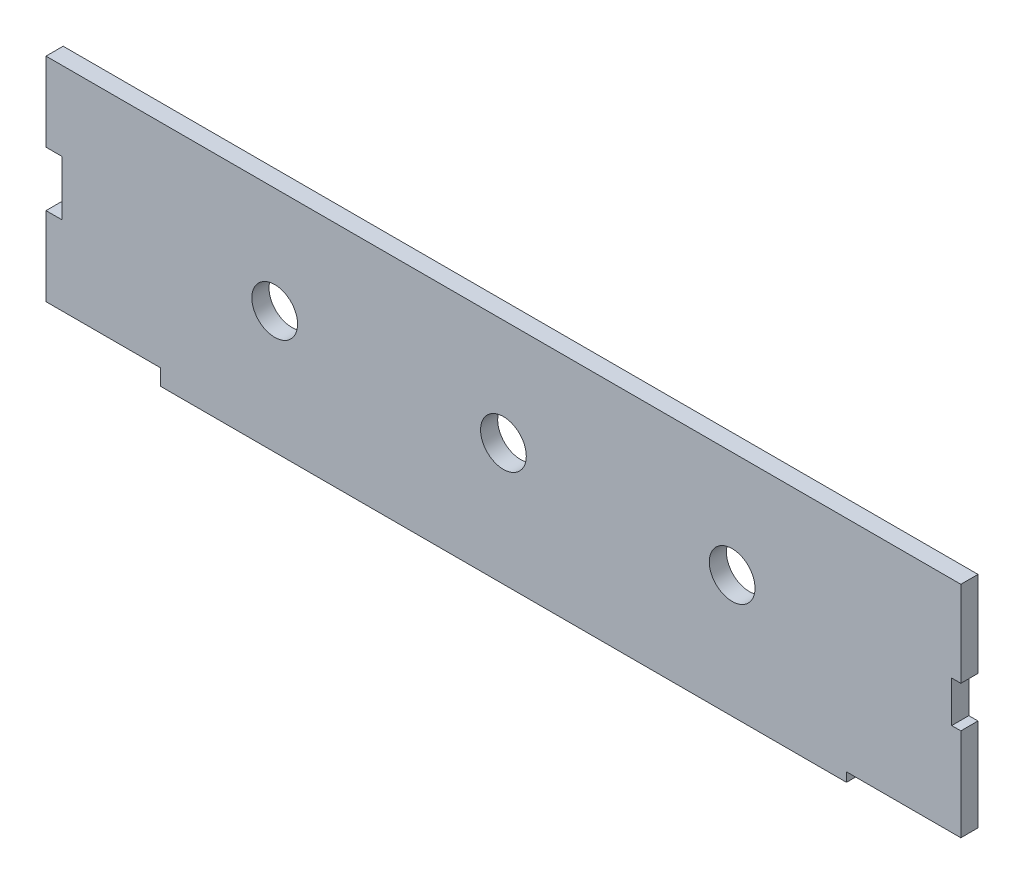
ISO-10303-21;
HEADER;
FILE_DESCRIPTION(('STEP AP214'),'2;1');
FILE_NAME('part.step','',(''),(''),'','','');
FILE_SCHEMA(('AUTOMOTIVE_DESIGN { 1 0 10303 214 1 1 1 1 }'));
ENDSEC;
DATA;
#1=APPLICATION_CONTEXT('core data for automotive mechanical design processes');
#2=APPLICATION_PROTOCOL_DEFINITION('international standard','automotive_design',2000,#1);
#3=PRODUCT_CONTEXT('',#1,'mechanical');
#4=PRODUCT('Part','Part','',(#3));
#5=PRODUCT_RELATED_PRODUCT_CATEGORY('part','',(#4));
#6=PRODUCT_DEFINITION_FORMATION('','',#4);
#7=PRODUCT_DEFINITION_CONTEXT('part definition',#1,'design');
#8=PRODUCT_DEFINITION('design','',#6,#7);
#9=PRODUCT_DEFINITION_SHAPE('','',#8);
#10=(LENGTH_UNIT() NAMED_UNIT(*) SI_UNIT(.MILLI.,.METRE.));
#11=(NAMED_UNIT(*) PLANE_ANGLE_UNIT() SI_UNIT($,.RADIAN.));
#12=(NAMED_UNIT(*) SI_UNIT($,.STERADIAN.) SOLID_ANGLE_UNIT());
#13=UNCERTAINTY_MEASURE_WITH_UNIT(LENGTH_MEASURE(1.E-05),#10,'distance_accuracy_value','');
#14=(GEOMETRIC_REPRESENTATION_CONTEXT(3) GLOBAL_UNCERTAINTY_ASSIGNED_CONTEXT((#13)) GLOBAL_UNIT_ASSIGNED_CONTEXT((#10,
#11,#12)) REPRESENTATION_CONTEXT('',''));
#15=CARTESIAN_POINT('',(0.,0.,0.));
#16=DIRECTION('',(0.,0.,1.));
#17=DIRECTION('',(1.,0.,0.));
#18=AXIS2_PLACEMENT_3D('',#15,#16,#17);
#19=CARTESIAN_POINT('',(0.,0.,1.5));
#20=DIRECTION('',(0.,0.,-1.));
#21=DIRECTION('',(-1.,0.,0.));
#22=AXIS2_PLACEMENT_3D('',#19,#20,#21);
#23=PLANE('',#22);
#24=DIRECTION('',(0.,-1.,0.));
#25=VECTOR('',#24,1.);
#26=CARTESIAN_POINT('',(-40.,2.4,1.5));
#27=LINE('',#26,#25);
#28=CARTESIAN_POINT('',(-40.,9.3,1.5));
#29=VERTEX_POINT('',#28);
#30=CARTESIAN_POINT('',(-40.,2.4,1.5));
#31=VERTEX_POINT('',#30);
#32=EDGE_CURVE('E209',#29,#31,#27,.T.);
#33=ORIENTED_EDGE('',*,*,#32,.T.);
#34=DIRECTION('',(1.,0.,0.));
#35=VECTOR('',#34,1.);
#36=CARTESIAN_POINT('',(-38.6,2.4,1.5));
#37=LINE('',#36,#35);
#38=CARTESIAN_POINT('',(-38.6,2.4,1.5));
#39=VERTEX_POINT('',#38);
#40=EDGE_CURVE('E117',#31,#39,#37,.T.);
#41=ORIENTED_EDGE('',*,*,#40,.T.);
#42=DIRECTION('',(0.,-1.,0.));
#43=VECTOR('',#42,1.);
#44=CARTESIAN_POINT('',(-38.6,-2.4,1.5));
#45=LINE('',#44,#43);
#46=CARTESIAN_POINT('',(-38.6,-2.4,1.5));
#47=VERTEX_POINT('',#46);
#48=EDGE_CURVE('E248',#39,#47,#45,.T.);
#49=ORIENTED_EDGE('',*,*,#48,.T.);
#50=DIRECTION('',(-1.,0.,0.));
#51=VECTOR('',#50,1.);
#52=CARTESIAN_POINT('',(-40.,-2.4,1.5));
#53=LINE('',#52,#51);
#54=CARTESIAN_POINT('',(-40.,-2.4,1.5));
#55=VERTEX_POINT('',#54);
#56=EDGE_CURVE('E267',#47,#55,#53,.T.);
#57=ORIENTED_EDGE('',*,*,#56,.T.);
#58=DIRECTION('',(0.,-1.,0.));
#59=VECTOR('',#58,1.);
#60=CARTESIAN_POINT('',(-40.,-9.3,1.5));
#61=LINE('',#60,#59);
#62=CARTESIAN_POINT('',(-40.,-9.3,1.5));
#63=VERTEX_POINT('',#62);
#64=EDGE_CURVE('E264',#55,#63,#61,.T.);
#65=ORIENTED_EDGE('',*,*,#64,.T.);
#66=DIRECTION('',(1.,0.,0.));
#67=VECTOR('',#66,1.);
#68=CARTESIAN_POINT('',(-30.,-9.3,1.5));
#69=LINE('',#68,#67);
#70=CARTESIAN_POINT('',(-30.,-9.3,1.5));
#71=VERTEX_POINT('',#70);
#72=EDGE_CURVE('E266',#63,#71,#69,.T.);
#73=ORIENTED_EDGE('',*,*,#72,.T.);
#74=DIRECTION('',(0.,-1.,0.));
#75=VECTOR('',#74,1.);
#76=CARTESIAN_POINT('',(-30.,-10.7,1.5));
#77=LINE('',#76,#75);
#78=CARTESIAN_POINT('',(-30.,-10.7,1.5));
#79=VERTEX_POINT('',#78);
#80=EDGE_CURVE('E269',#71,#79,#77,.T.);
#81=ORIENTED_EDGE('',*,*,#80,.T.);
#82=DIRECTION('',(1.,0.,0.));
#83=VECTOR('',#82,1.);
#84=CARTESIAN_POINT('',(30.,-10.7,1.5));
#85=LINE('',#84,#83);
#86=CARTESIAN_POINT('',(30.,-10.7,1.5));
#87=VERTEX_POINT('',#86);
#88=EDGE_CURVE('E275',#79,#87,#85,.T.);
#89=ORIENTED_EDGE('',*,*,#88,.T.);
#90=DIRECTION('',(0.,1.,0.));
#91=VECTOR('',#90,1.);
#92=CARTESIAN_POINT('',(30.,-9.89999999999999,1.5));
#93=LINE('',#92,#91);
#94=CARTESIAN_POINT('',(30.,-9.89999999999999,1.5));
#95=VERTEX_POINT('',#94);
#96=EDGE_CURVE('E277',#87,#95,#93,.T.);
#97=ORIENTED_EDGE('',*,*,#96,.T.);
#98=DIRECTION('',(1.,0.,0.));
#99=VECTOR('',#98,1.);
#100=CARTESIAN_POINT('',(40.,-9.89999999999998,1.5));
#101=LINE('',#100,#99);
#102=CARTESIAN_POINT('',(40.,-9.89999999999998,1.5));
#103=VERTEX_POINT('',#102);
#104=EDGE_CURVE('E279',#95,#103,#101,.T.);
#105=ORIENTED_EDGE('',*,*,#104,.T.);
#106=DIRECTION('',(0.,1.,0.));
#107=VECTOR('',#106,1.);
#108=CARTESIAN_POINT('',(40.,-1.8,1.5));
#109=LINE('',#108,#107);
#110=CARTESIAN_POINT('',(40.,-1.8,1.5));
#111=VERTEX_POINT('',#110);
#112=EDGE_CURVE('E281',#103,#111,#109,.T.);
#113=ORIENTED_EDGE('',*,*,#112,.T.);
#114=DIRECTION('',(-1.,0.,0.));
#115=VECTOR('',#114,1.);
#116=CARTESIAN_POINT('',(39.2,-1.8,1.5));
#117=LINE('',#116,#115);
#118=CARTESIAN_POINT('',(39.2,-1.8,1.5));
#119=VERTEX_POINT('',#118);
#120=EDGE_CURVE('E283',#111,#119,#117,.T.);
#121=ORIENTED_EDGE('',*,*,#120,.T.);
#122=DIRECTION('',(0.,1.,0.));
#123=VECTOR('',#122,1.);
#124=CARTESIAN_POINT('',(39.2,1.8,1.5));
#125=LINE('',#124,#123);
#126=CARTESIAN_POINT('',(39.2,1.8,1.5));
#127=VERTEX_POINT('',#126);
#128=EDGE_CURVE('E160',#119,#127,#125,.T.);
#129=ORIENTED_EDGE('',*,*,#128,.T.);
#130=DIRECTION('',(1.,0.,0.));
#131=VECTOR('',#130,1.);
#132=CARTESIAN_POINT('',(40.,1.8,1.5));
#133=LINE('',#132,#131);
#134=CARTESIAN_POINT('',(40.,1.8,1.5));
#135=VERTEX_POINT('',#134);
#136=EDGE_CURVE('E154',#127,#135,#133,.T.);
#137=ORIENTED_EDGE('',*,*,#136,.T.);
#138=DIRECTION('',(0.,1.,0.));
#139=VECTOR('',#138,1.);
#140=CARTESIAN_POINT('',(40.,9.3,1.5));
#141=LINE('',#140,#139);
#142=CARTESIAN_POINT('',(40.,9.3,1.5));
#143=VERTEX_POINT('',#142);
#144=EDGE_CURVE('E158',#135,#143,#141,.T.);
#145=ORIENTED_EDGE('',*,*,#144,.T.);
#146=DIRECTION('',(-1.,0.,0.));
#147=VECTOR('',#146,1.);
#148=CARTESIAN_POINT('',(-40.,9.3,1.5));
#149=LINE('',#148,#147);
#150=EDGE_CURVE('E50',#143,#29,#149,.T.);
#151=ORIENTED_EDGE('',*,*,#150,.T.);
#152=EDGE_LOOP('',(#33,#41,#49,#57,#65,#73,#81,#89,#97,#105,#113,#121,#129,#137,#145,#151));
#153=FACE_BOUND('',#152,.T.);
#154=CARTESIAN_POINT('',(20.,0.,1.5));
#155=DIRECTION('',(0.,0.,1.));
#156=DIRECTION('',(1.,0.,0.));
#157=AXIS2_PLACEMENT_3D('',#154,#155,#156);
#158=CIRCLE('',#157,2.);
#159=CARTESIAN_POINT('',(22.,0.,1.5));
#160=VERTEX_POINT('',#159);
#161=EDGE_CURVE('E182',#160,#160,#158,.T.);
#162=ORIENTED_EDGE('',*,*,#161,.F.);
#163=EDGE_LOOP('',(#162));
#164=FACE_BOUND('',#163,.T.);
#165=CARTESIAN_POINT('',(0.,0.,1.5));
#166=DIRECTION('',(0.,0.,1.));
#167=DIRECTION('',(1.,0.,0.));
#168=AXIS2_PLACEMENT_3D('',#165,#166,#167);
#169=CIRCLE('',#168,2.);
#170=CARTESIAN_POINT('',(2.,0.,1.5));
#171=VERTEX_POINT('',#170);
#172=EDGE_CURVE('E337',#171,#171,#169,.T.);
#173=ORIENTED_EDGE('',*,*,#172,.F.);
#174=EDGE_LOOP('',(#173));
#175=FACE_BOUND('',#174,.T.);
#176=CARTESIAN_POINT('',(-20.,0.,1.5));
#177=DIRECTION('',(0.,0.,1.));
#178=DIRECTION('',(1.,0.,0.));
#179=AXIS2_PLACEMENT_3D('',#176,#177,#178);
#180=CIRCLE('',#179,2.);
#181=CARTESIAN_POINT('',(-18.,0.,1.5));
#182=VERTEX_POINT('',#181);
#183=EDGE_CURVE('E328',#182,#182,#180,.T.);
#184=ORIENTED_EDGE('',*,*,#183,.F.);
#185=EDGE_LOOP('',(#184));
#186=FACE_BOUND('',#185,.T.);
#187=ADVANCED_FACE('F33',(#153,#164,#175,#186),#23,.F.);
#188=CARTESIAN_POINT('',(0.,0.,0.));
#189=DIRECTION('',(0.,0.,-1.));
#190=DIRECTION('',(-1.,0.,0.));
#191=AXIS2_PLACEMENT_3D('',#188,#189,#190);
#192=PLANE('',#191);
#193=CARTESIAN_POINT('',(0.,0.,0.));
#194=DIRECTION('',(0.,0.,1.));
#195=DIRECTION('',(1.,0.,0.));
#196=AXIS2_PLACEMENT_3D('',#193,#194,#195);
#197=CIRCLE('',#196,2.);
#198=CARTESIAN_POINT('',(2.,0.,0.));
#199=VERTEX_POINT('',#198);
#200=EDGE_CURVE('E334',#199,#199,#197,.T.);
#201=ORIENTED_EDGE('',*,*,#200,.T.);
#202=EDGE_LOOP('',(#201));
#203=FACE_BOUND('',#202,.T.);
#204=DIRECTION('',(0.,-1.,0.));
#205=VECTOR('',#204,1.);
#206=CARTESIAN_POINT('',(-40.,2.4,0.));
#207=LINE('',#206,#205);
#208=CARTESIAN_POINT('',(-40.,9.3,0.));
#209=VERTEX_POINT('',#208);
#210=CARTESIAN_POINT('',(-40.,2.4,0.));
#211=VERTEX_POINT('',#210);
#212=EDGE_CURVE('E178',#209,#211,#207,.T.);
#213=ORIENTED_EDGE('',*,*,#212,.F.);
#214=DIRECTION('',(-1.,0.,0.));
#215=VECTOR('',#214,1.);
#216=CARTESIAN_POINT('',(-40.,9.3,0.));
#217=LINE('',#216,#215);
#218=CARTESIAN_POINT('',(40.,9.3,0.));
#219=VERTEX_POINT('',#218);
#220=EDGE_CURVE('E109',#219,#209,#217,.T.);
#221=ORIENTED_EDGE('',*,*,#220,.F.);
#222=DIRECTION('',(0.,1.,0.));
#223=VECTOR('',#222,1.);
#224=CARTESIAN_POINT('',(40.,9.3,0.));
#225=LINE('',#224,#223);
#226=CARTESIAN_POINT('',(40.,1.8,0.));
#227=VERTEX_POINT('',#226);
#228=EDGE_CURVE('E103',#227,#219,#225,.T.);
#229=ORIENTED_EDGE('',*,*,#228,.F.);
#230=DIRECTION('',(1.,0.,0.));
#231=VECTOR('',#230,1.);
#232=CARTESIAN_POINT('',(40.,1.8,0.));
#233=LINE('',#232,#231);
#234=CARTESIAN_POINT('',(39.2,1.8,0.));
#235=VERTEX_POINT('',#234);
#236=EDGE_CURVE('E168',#235,#227,#233,.T.);
#237=ORIENTED_EDGE('',*,*,#236,.F.);
#238=DIRECTION('',(0.,1.,0.));
#239=VECTOR('',#238,1.);
#240=CARTESIAN_POINT('',(39.2,1.8,0.));
#241=LINE('',#240,#239);
#242=CARTESIAN_POINT('',(39.2,-1.8,0.));
#243=VERTEX_POINT('',#242);
#244=EDGE_CURVE('E204',#243,#235,#241,.T.);
#245=ORIENTED_EDGE('',*,*,#244,.F.);
#246=DIRECTION('',(-1.,0.,0.));
#247=VECTOR('',#246,1.);
#248=CARTESIAN_POINT('',(39.2,-1.8,0.));
#249=LINE('',#248,#247);
#250=CARTESIAN_POINT('',(40.,-1.8,0.));
#251=VERTEX_POINT('',#250);
#252=EDGE_CURVE('E202',#251,#243,#249,.T.);
#253=ORIENTED_EDGE('',*,*,#252,.F.);
#254=DIRECTION('',(0.,1.,0.));
#255=VECTOR('',#254,1.);
#256=CARTESIAN_POINT('',(40.,-1.8,0.));
#257=LINE('',#256,#255);
#258=CARTESIAN_POINT('',(40.,-9.89999999999998,0.));
#259=VERTEX_POINT('',#258);
#260=EDGE_CURVE('E200',#259,#251,#257,.T.);
#261=ORIENTED_EDGE('',*,*,#260,.F.);
#262=DIRECTION('',(1.,0.,0.));
#263=VECTOR('',#262,1.);
#264=CARTESIAN_POINT('',(40.,-9.89999999999998,0.));
#265=LINE('',#264,#263);
#266=CARTESIAN_POINT('',(30.,-9.89999999999999,0.));
#267=VERTEX_POINT('',#266);
#268=EDGE_CURVE('E198',#267,#259,#265,.T.);
#269=ORIENTED_EDGE('',*,*,#268,.F.);
#270=DIRECTION('',(0.,1.,0.));
#271=VECTOR('',#270,1.);
#272=CARTESIAN_POINT('',(30.,-9.89999999999999,0.));
#273=LINE('',#272,#271);
#274=CARTESIAN_POINT('',(30.,-10.7,0.));
#275=VERTEX_POINT('',#274);
#276=EDGE_CURVE('E196',#275,#267,#273,.T.);
#277=ORIENTED_EDGE('',*,*,#276,.F.);
#278=DIRECTION('',(1.,0.,0.));
#279=VECTOR('',#278,1.);
#280=CARTESIAN_POINT('',(30.,-10.7,0.));
#281=LINE('',#280,#279);
#282=CARTESIAN_POINT('',(-30.,-10.7,0.));
#283=VERTEX_POINT('',#282);
#284=EDGE_CURVE('E194',#283,#275,#281,.T.);
#285=ORIENTED_EDGE('',*,*,#284,.F.);
#286=DIRECTION('',(0.,-1.,0.));
#287=VECTOR('',#286,1.);
#288=CARTESIAN_POINT('',(-30.,-10.7,0.));
#289=LINE('',#288,#287);
#290=CARTESIAN_POINT('',(-30.,-9.3,0.));
#291=VERTEX_POINT('',#290);
#292=EDGE_CURVE('E192',#291,#283,#289,.T.);
#293=ORIENTED_EDGE('',*,*,#292,.F.);
#294=DIRECTION('',(1.,0.,0.));
#295=VECTOR('',#294,1.);
#296=CARTESIAN_POINT('',(-30.,-9.3,0.));
#297=LINE('',#296,#295);
#298=CARTESIAN_POINT('',(-40.,-9.3,0.));
#299=VERTEX_POINT('',#298);
#300=EDGE_CURVE('E190',#299,#291,#297,.T.);
#301=ORIENTED_EDGE('',*,*,#300,.F.);
#302=DIRECTION('',(0.,-1.,0.));
#303=VECTOR('',#302,1.);
#304=CARTESIAN_POINT('',(-40.,-9.3,0.));
#305=LINE('',#304,#303);
#306=CARTESIAN_POINT('',(-40.,-2.4,0.));
#307=VERTEX_POINT('',#306);
#308=EDGE_CURVE('E188',#307,#299,#305,.T.);
#309=ORIENTED_EDGE('',*,*,#308,.F.);
#310=DIRECTION('',(-1.,0.,0.));
#311=VECTOR('',#310,1.);
#312=CARTESIAN_POINT('',(-40.,-2.4,0.));
#313=LINE('',#312,#311);
#314=CARTESIAN_POINT('',(-38.6,-2.4,0.));
#315=VERTEX_POINT('',#314);
#316=EDGE_CURVE('E186',#315,#307,#313,.T.);
#317=ORIENTED_EDGE('',*,*,#316,.F.);
#318=DIRECTION('',(0.,-1.,0.));
#319=VECTOR('',#318,1.);
#320=CARTESIAN_POINT('',(-38.6,-2.4,0.));
#321=LINE('',#320,#319);
#322=CARTESIAN_POINT('',(-38.6,2.4,0.));
#323=VERTEX_POINT('',#322);
#324=EDGE_CURVE('E184',#323,#315,#321,.T.);
#325=ORIENTED_EDGE('',*,*,#324,.F.);
#326=DIRECTION('',(1.,0.,0.));
#327=VECTOR('',#326,1.);
#328=CARTESIAN_POINT('',(-38.6,2.4,0.));
#329=LINE('',#328,#327);
#330=EDGE_CURVE('E181',#211,#323,#329,.T.);
#331=ORIENTED_EDGE('',*,*,#330,.F.);
#332=EDGE_LOOP('',(#213,#221,#229,#237,#245,#253,#261,#269,#277,#285,#293,#301,#309,#317,#325,#331));
#333=FACE_BOUND('',#332,.T.);
#334=CARTESIAN_POINT('',(20.,0.,0.));
#335=DIRECTION('',(0.,0.,1.));
#336=DIRECTION('',(1.,0.,0.));
#337=AXIS2_PLACEMENT_3D('',#334,#335,#336);
#338=CIRCLE('',#337,2.);
#339=CARTESIAN_POINT('',(22.,0.,0.));
#340=VERTEX_POINT('',#339);
#341=EDGE_CURVE('E340',#340,#340,#338,.T.);
#342=ORIENTED_EDGE('',*,*,#341,.T.);
#343=EDGE_LOOP('',(#342));
#344=FACE_BOUND('',#343,.T.);
#345=CARTESIAN_POINT('',(-20.,0.,0.));
#346=DIRECTION('',(0.,0.,1.));
#347=DIRECTION('',(1.,0.,0.));
#348=AXIS2_PLACEMENT_3D('',#345,#346,#347);
#349=CIRCLE('',#348,2.);
#350=CARTESIAN_POINT('',(-18.,0.,0.));
#351=VERTEX_POINT('',#350);
#352=EDGE_CURVE('E331',#351,#351,#349,.T.);
#353=ORIENTED_EDGE('',*,*,#352,.T.);
#354=EDGE_LOOP('',(#353));
#355=FACE_BOUND('',#354,.T.);
#356=ADVANCED_FACE('F252',(#203,#333,#344,#355),#192,.T.);
#357=CARTESIAN_POINT('',(-40.,2.4,1.5));
#358=DIRECTION('',(1.,0.,0.));
#359=DIRECTION('',(0.,1.,0.));
#360=AXIS2_PLACEMENT_3D('',#357,#358,#359);
#361=PLANE('',#360);
#362=ORIENTED_EDGE('',*,*,#212,.T.);
#363=DIRECTION('',(0.,0.,-1.));
#364=VECTOR('',#363,1.);
#365=CARTESIAN_POINT('',(-40.,2.4,1.5));
#366=LINE('',#365,#364);
#367=EDGE_CURVE('E11',#31,#211,#366,.T.);
#368=ORIENTED_EDGE('',*,*,#367,.F.);
#369=ORIENTED_EDGE('',*,*,#32,.F.);
#370=DIRECTION('',(0.,0.,-1.));
#371=VECTOR('',#370,1.);
#372=CARTESIAN_POINT('',(-40.,9.3,1.5));
#373=LINE('',#372,#371);
#374=EDGE_CURVE('E174',#29,#209,#373,.T.);
#375=ORIENTED_EDGE('',*,*,#374,.T.);
#376=EDGE_LOOP('',(#362,#368,#369,#375));
#377=FACE_BOUND('',#376,.T.);
#378=ADVANCED_FACE('F35',(#377),#361,.F.);
#379=CARTESIAN_POINT('',(-38.6,2.4,1.5));
#380=DIRECTION('',(0.,1.,0.));
#381=DIRECTION('',(0.,0.,1.));
#382=AXIS2_PLACEMENT_3D('',#379,#380,#381);
#383=PLANE('',#382);
#384=ORIENTED_EDGE('',*,*,#330,.T.);
#385=DIRECTION('',(0.,0.,-1.));
#386=VECTOR('',#385,1.);
#387=CARTESIAN_POINT('',(-38.6,2.4,1.5));
#388=LINE('',#387,#386);
#389=EDGE_CURVE('E42',#39,#323,#388,.T.);
#390=ORIENTED_EDGE('',*,*,#389,.F.);
#391=ORIENTED_EDGE('',*,*,#40,.F.);
#392=ORIENTED_EDGE('',*,*,#367,.T.);
#393=EDGE_LOOP('',(#384,#390,#391,#392));
#394=FACE_BOUND('',#393,.T.);
#395=ADVANCED_FACE('F483',(#394),#383,.F.);
#396=CARTESIAN_POINT('',(-38.6,-2.4,1.5));
#397=DIRECTION('',(1.,0.,0.));
#398=DIRECTION('',(0.,0.,-1.));
#399=AXIS2_PLACEMENT_3D('',#396,#397,#398);
#400=PLANE('',#399);
#401=ORIENTED_EDGE('',*,*,#324,.T.);
#402=DIRECTION('',(0.,0.,-1.));
#403=VECTOR('',#402,1.);
#404=CARTESIAN_POINT('',(-38.6,-2.4,1.5));
#405=LINE('',#404,#403);
#406=EDGE_CURVE('E240',#47,#315,#405,.T.);
#407=ORIENTED_EDGE('',*,*,#406,.F.);
#408=ORIENTED_EDGE('',*,*,#48,.F.);
#409=ORIENTED_EDGE('',*,*,#389,.T.);
#410=EDGE_LOOP('',(#401,#407,#408,#409));
#411=FACE_BOUND('',#410,.T.);
#412=ADVANCED_FACE('F246',(#411),#400,.F.);
#413=CARTESIAN_POINT('',(-40.,-2.4,1.5));
#414=DIRECTION('',(0.,-1.,0.));
#415=DIRECTION('',(0.,0.,-1.));
#416=AXIS2_PLACEMENT_3D('',#413,#414,#415);
#417=PLANE('',#416);
#418=ORIENTED_EDGE('',*,*,#316,.T.);
#419=DIRECTION('',(0.,0.,-1.));
#420=VECTOR('',#419,1.);
#421=CARTESIAN_POINT('',(-40.,-2.4,1.5));
#422=LINE('',#421,#420);
#423=EDGE_CURVE('E237',#55,#307,#422,.T.);
#424=ORIENTED_EDGE('',*,*,#423,.F.);
#425=ORIENTED_EDGE('',*,*,#56,.F.);
#426=ORIENTED_EDGE('',*,*,#406,.T.);
#427=EDGE_LOOP('',(#418,#424,#425,#426));
#428=FACE_BOUND('',#427,.T.);
#429=ADVANCED_FACE('F258',(#428),#417,.F.);
#430=CARTESIAN_POINT('',(-40.,-9.3,1.5));
#431=DIRECTION('',(1.,0.,0.));
#432=DIRECTION('',(0.,1.,0.));
#433=AXIS2_PLACEMENT_3D('',#430,#431,#432);
#434=PLANE('',#433);
#435=ORIENTED_EDGE('',*,*,#308,.T.);
#436=DIRECTION('',(0.,0.,-1.));
#437=VECTOR('',#436,1.);
#438=CARTESIAN_POINT('',(-40.,-9.3,1.5));
#439=LINE('',#438,#437);
#440=EDGE_CURVE('E234',#63,#299,#439,.T.);
#441=ORIENTED_EDGE('',*,*,#440,.F.);
#442=ORIENTED_EDGE('',*,*,#64,.F.);
#443=ORIENTED_EDGE('',*,*,#423,.T.);
#444=EDGE_LOOP('',(#435,#441,#442,#443));
#445=FACE_BOUND('',#444,.T.);
#446=ADVANCED_FACE('F262',(#445),#434,.F.);
#447=CARTESIAN_POINT('',(-30.,-9.3,1.5));
#448=DIRECTION('',(0.,1.,0.));
#449=DIRECTION('',(0.,0.,1.));
#450=AXIS2_PLACEMENT_3D('',#447,#448,#449);
#451=PLANE('',#450);
#452=ORIENTED_EDGE('',*,*,#300,.T.);
#453=DIRECTION('',(0.,0.,-1.));
#454=VECTOR('',#453,1.);
#455=CARTESIAN_POINT('',(-30.,-9.3,1.5));
#456=LINE('',#455,#454);
#457=EDGE_CURVE('E231',#71,#291,#456,.T.);
#458=ORIENTED_EDGE('',*,*,#457,.F.);
#459=ORIENTED_EDGE('',*,*,#72,.F.);
#460=ORIENTED_EDGE('',*,*,#440,.T.);
#461=EDGE_LOOP('',(#452,#458,#459,#460));
#462=FACE_BOUND('',#461,.T.);
#463=ADVANCED_FACE('F448',(#462),#451,.F.);
#464=CARTESIAN_POINT('',(-30.,-10.7,1.5));
#465=DIRECTION('',(1.,0.,0.));
#466=DIRECTION('',(0.,0.,-1.));
#467=AXIS2_PLACEMENT_3D('',#464,#465,#466);
#468=PLANE('',#467);
#469=ORIENTED_EDGE('',*,*,#292,.T.);
#470=DIRECTION('',(0.,0.,-1.));
#471=VECTOR('',#470,1.);
#472=CARTESIAN_POINT('',(-30.,-10.7,1.5));
#473=LINE('',#472,#471);
#474=EDGE_CURVE('E228',#79,#283,#473,.T.);
#475=ORIENTED_EDGE('',*,*,#474,.F.);
#476=ORIENTED_EDGE('',*,*,#80,.F.);
#477=ORIENTED_EDGE('',*,*,#457,.T.);
#478=EDGE_LOOP('',(#469,#475,#476,#477));
#479=FACE_BOUND('',#478,.T.);
#480=ADVANCED_FACE('F438',(#479),#468,.F.);
#481=CARTESIAN_POINT('',(30.,-10.7,1.5));
#482=DIRECTION('',(0.,1.,0.));
#483=DIRECTION('',(-1.,0.,0.));
#484=AXIS2_PLACEMENT_3D('',#481,#482,#483);
#485=PLANE('',#484);
#486=ORIENTED_EDGE('',*,*,#284,.T.);
#487=DIRECTION('',(0.,0.,-1.));
#488=VECTOR('',#487,1.);
#489=CARTESIAN_POINT('',(30.,-10.7,1.5));
#490=LINE('',#489,#488);
#491=EDGE_CURVE('E225',#87,#275,#490,.T.);
#492=ORIENTED_EDGE('',*,*,#491,.F.);
#493=ORIENTED_EDGE('',*,*,#88,.F.);
#494=ORIENTED_EDGE('',*,*,#474,.T.);
#495=EDGE_LOOP('',(#486,#492,#493,#494));
#496=FACE_BOUND('',#495,.T.);
#497=ADVANCED_FACE('F428',(#496),#485,.F.);
#498=CARTESIAN_POINT('',(30.,-9.89999999999999,1.5));
#499=DIRECTION('',(-1.,0.,0.));
#500=DIRECTION('',(0.,0.,1.));
#501=AXIS2_PLACEMENT_3D('',#498,#499,#500);
#502=PLANE('',#501);
#503=ORIENTED_EDGE('',*,*,#276,.T.);
#504=DIRECTION('',(0.,0.,-1.));
#505=VECTOR('',#504,1.);
#506=CARTESIAN_POINT('',(30.,-9.89999999999999,1.5));
#507=LINE('',#506,#505);
#508=EDGE_CURVE('E222',#95,#267,#507,.T.);
#509=ORIENTED_EDGE('',*,*,#508,.F.);
#510=ORIENTED_EDGE('',*,*,#96,.F.);
#511=ORIENTED_EDGE('',*,*,#491,.T.);
#512=EDGE_LOOP('',(#503,#509,#510,#511));
#513=FACE_BOUND('',#512,.T.);
#514=ADVANCED_FACE('F418',(#513),#502,.F.);
#515=CARTESIAN_POINT('',(40.,-9.89999999999998,1.5));
#516=DIRECTION('',(0.,1.,0.));
#517=DIRECTION('',(-1.,0.,0.));
#518=AXIS2_PLACEMENT_3D('',#515,#516,#517);
#519=PLANE('',#518);
#520=ORIENTED_EDGE('',*,*,#268,.T.);
#521=DIRECTION('',(0.,0.,-1.));
#522=VECTOR('',#521,1.);
#523=CARTESIAN_POINT('',(40.,-9.89999999999998,1.5));
#524=LINE('',#523,#522);
#525=EDGE_CURVE('E219',#103,#259,#524,.T.);
#526=ORIENTED_EDGE('',*,*,#525,.F.);
#527=ORIENTED_EDGE('',*,*,#104,.F.);
#528=ORIENTED_EDGE('',*,*,#508,.T.);
#529=EDGE_LOOP('',(#520,#526,#527,#528));
#530=FACE_BOUND('',#529,.T.);
#531=ADVANCED_FACE('F408',(#530),#519,.F.);
#532=CARTESIAN_POINT('',(40.,-1.8,1.5));
#533=DIRECTION('',(-1.,0.,0.));
#534=DIRECTION('',(0.,0.,1.));
#535=AXIS2_PLACEMENT_3D('',#532,#533,#534);
#536=PLANE('',#535);
#537=ORIENTED_EDGE('',*,*,#260,.T.);
#538=DIRECTION('',(0.,0.,-1.));
#539=VECTOR('',#538,1.);
#540=CARTESIAN_POINT('',(40.,-1.8,1.5));
#541=LINE('',#540,#539);
#542=EDGE_CURVE('E216',#111,#251,#541,.T.);
#543=ORIENTED_EDGE('',*,*,#542,.F.);
#544=ORIENTED_EDGE('',*,*,#112,.F.);
#545=ORIENTED_EDGE('',*,*,#525,.T.);
#546=EDGE_LOOP('',(#537,#543,#544,#545));
#547=FACE_BOUND('',#546,.T.);
#548=ADVANCED_FACE('F399',(#547),#536,.F.);
#549=CARTESIAN_POINT('',(39.2,-1.8,1.5));
#550=DIRECTION('',(0.,-1.,0.));
#551=DIRECTION('',(0.,0.,-1.));
#552=AXIS2_PLACEMENT_3D('',#549,#550,#551);
#553=PLANE('',#552);
#554=ORIENTED_EDGE('',*,*,#252,.T.);
#555=DIRECTION('',(0.,0.,-1.));
#556=VECTOR('',#555,1.);
#557=CARTESIAN_POINT('',(39.2,-1.8,1.5));
#558=LINE('',#557,#556);
#559=EDGE_CURVE('E213',#119,#243,#558,.T.);
#560=ORIENTED_EDGE('',*,*,#559,.F.);
#561=ORIENTED_EDGE('',*,*,#120,.F.);
#562=ORIENTED_EDGE('',*,*,#542,.T.);
#563=EDGE_LOOP('',(#554,#560,#561,#562));
#564=FACE_BOUND('',#563,.T.);
#565=ADVANCED_FACE('F289',(#564),#553,.F.);
#566=CARTESIAN_POINT('',(39.2,1.8,1.5));
#567=DIRECTION('',(-1.,0.,0.));
#568=DIRECTION('',(0.,0.,1.));
#569=AXIS2_PLACEMENT_3D('',#566,#567,#568);
#570=PLANE('',#569);
#571=ORIENTED_EDGE('',*,*,#244,.T.);
#572=DIRECTION('',(0.,0.,-1.));
#573=VECTOR('',#572,1.);
#574=CARTESIAN_POINT('',(39.2,1.8,1.5));
#575=LINE('',#574,#573);
#576=EDGE_CURVE('E169',#127,#235,#575,.T.);
#577=ORIENTED_EDGE('',*,*,#576,.F.);
#578=ORIENTED_EDGE('',*,*,#128,.F.);
#579=ORIENTED_EDGE('',*,*,#559,.T.);
#580=EDGE_LOOP('',(#571,#577,#578,#579));
#581=FACE_BOUND('',#580,.T.);
#582=ADVANCED_FACE('F293',(#581),#570,.F.);
#583=CARTESIAN_POINT('',(40.,1.8,1.5));
#584=DIRECTION('',(0.,1.,0.));
#585=DIRECTION('',(0.,0.,1.));
#586=AXIS2_PLACEMENT_3D('',#583,#584,#585);
#587=PLANE('',#586);
#588=ORIENTED_EDGE('',*,*,#236,.T.);
#589=DIRECTION('',(0.,0.,-1.));
#590=VECTOR('',#589,1.);
#591=CARTESIAN_POINT('',(40.,1.8,1.5));
#592=LINE('',#591,#590);
#593=EDGE_CURVE('E165',#135,#227,#592,.T.);
#594=ORIENTED_EDGE('',*,*,#593,.F.);
#595=ORIENTED_EDGE('',*,*,#136,.F.);
#596=ORIENTED_EDGE('',*,*,#576,.T.);
#597=EDGE_LOOP('',(#588,#594,#595,#596));
#598=FACE_BOUND('',#597,.T.);
#599=ADVANCED_FACE('F166',(#598),#587,.F.);
#600=CARTESIAN_POINT('',(40.,9.3,1.5));
#601=DIRECTION('',(-1.,0.,0.));
#602=DIRECTION('',(0.,0.,1.));
#603=AXIS2_PLACEMENT_3D('',#600,#601,#602);
#604=PLANE('',#603);
#605=ORIENTED_EDGE('',*,*,#228,.T.);
#606=DIRECTION('',(0.,0.,-1.));
#607=VECTOR('',#606,1.);
#608=CARTESIAN_POINT('',(40.,9.3,1.5));
#609=LINE('',#608,#607);
#610=EDGE_CURVE('E170',#143,#219,#609,.T.);
#611=ORIENTED_EDGE('',*,*,#610,.F.);
#612=ORIENTED_EDGE('',*,*,#144,.F.);
#613=ORIENTED_EDGE('',*,*,#593,.T.);
#614=EDGE_LOOP('',(#605,#611,#612,#613));
#615=FACE_BOUND('',#614,.T.);
#616=ADVANCED_FACE('F172',(#615),#604,.F.);
#617=CARTESIAN_POINT('',(-40.,9.3,1.5));
#618=DIRECTION('',(0.,-1.,0.));
#619=DIRECTION('',(0.,0.,-1.));
#620=AXIS2_PLACEMENT_3D('',#617,#618,#619);
#621=PLANE('',#620);
#622=ORIENTED_EDGE('',*,*,#220,.T.);
#623=ORIENTED_EDGE('',*,*,#374,.F.);
#624=ORIENTED_EDGE('',*,*,#150,.F.);
#625=ORIENTED_EDGE('',*,*,#610,.T.);
#626=EDGE_LOOP('',(#622,#623,#624,#625));
#627=FACE_BOUND('',#626,.T.);
#628=ADVANCED_FACE('F297',(#627),#621,.F.);
#629=CARTESIAN_POINT('',(20.,0.,1.5));
#630=DIRECTION('',(0.,0.,-1.));
#631=DIRECTION('',(-1.,0.,0.));
#632=AXIS2_PLACEMENT_3D('',#629,#630,#631);
#633=CYLINDRICAL_SURFACE('',#632,2.);
#634=ORIENTED_EDGE('',*,*,#161,.T.);
#635=EDGE_LOOP('',(#634));
#636=FACE_BOUND('',#635,.T.);
#637=ORIENTED_EDGE('',*,*,#341,.F.);
#638=EDGE_LOOP('',(#637));
#639=FACE_BOUND('',#638,.T.);
#640=ADVANCED_FACE('F299',(#636,#639),#633,.F.);
#641=CARTESIAN_POINT('',(0.,0.,1.5));
#642=DIRECTION('',(0.,0.,-1.));
#643=DIRECTION('',(-1.,0.,0.));
#644=AXIS2_PLACEMENT_3D('',#641,#642,#643);
#645=CYLINDRICAL_SURFACE('',#644,2.);
#646=ORIENTED_EDGE('',*,*,#172,.T.);
#647=EDGE_LOOP('',(#646));
#648=FACE_BOUND('',#647,.T.);
#649=ORIENTED_EDGE('',*,*,#200,.F.);
#650=EDGE_LOOP('',(#649));
#651=FACE_BOUND('',#650,.T.);
#652=ADVANCED_FACE('F305',(#648,#651),#645,.F.);
#653=CARTESIAN_POINT('',(-20.,0.,1.5));
#654=DIRECTION('',(0.,0.,-1.));
#655=DIRECTION('',(-1.,0.,0.));
#656=AXIS2_PLACEMENT_3D('',#653,#654,#655);
#657=CYLINDRICAL_SURFACE('',#656,2.);
#658=ORIENTED_EDGE('',*,*,#183,.T.);
#659=EDGE_LOOP('',(#658));
#660=FACE_BOUND('',#659,.T.);
#661=ORIENTED_EDGE('',*,*,#352,.F.);
#662=EDGE_LOOP('',(#661));
#663=FACE_BOUND('',#662,.T.);
#664=ADVANCED_FACE('F319',(#660,#663),#657,.F.);
#665=CLOSED_SHELL('',(#187,#356,#378,#395,#412,#429,#446,#463,#480,#497,#514,#531,#548,#565,
#582,#599,#616,#628,#640,#652,#664));
#666=MANIFOLD_SOLID_BREP('B2',#665);
#667=ADVANCED_BREP_SHAPE_REPRESENTATION('',(#18,#666),#14);
#668=SHAPE_DEFINITION_REPRESENTATION(#9,#667);
ENDSEC;
END-ISO-10303-21;
